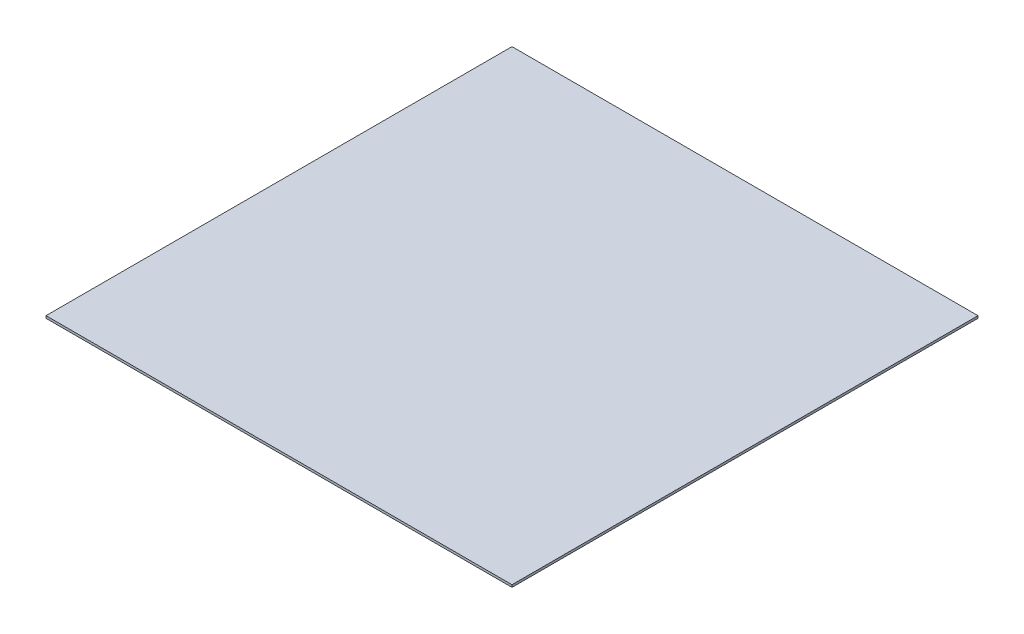
ISO-10303-21;
HEADER;
FILE_DESCRIPTION(('STEP AP214'),'2;1');
FILE_NAME('part.step','',(''),(''),'','','');
FILE_SCHEMA(('AUTOMOTIVE_DESIGN { 1 0 10303 214 1 1 1 1 }'));
ENDSEC;
DATA;
#1=APPLICATION_CONTEXT('core data for automotive mechanical design processes');
#2=APPLICATION_PROTOCOL_DEFINITION('international standard','automotive_design',2000,#1);
#3=PRODUCT_CONTEXT('',#1,'mechanical');
#4=PRODUCT('Part','Part','',(#3));
#5=PRODUCT_RELATED_PRODUCT_CATEGORY('part','',(#4));
#6=PRODUCT_DEFINITION_FORMATION('','',#4);
#7=PRODUCT_DEFINITION_CONTEXT('part definition',#1,'design');
#8=PRODUCT_DEFINITION('design','',#6,#7);
#9=PRODUCT_DEFINITION_SHAPE('','',#8);
#10=(LENGTH_UNIT() NAMED_UNIT(*) SI_UNIT(.MILLI.,.METRE.));
#11=(NAMED_UNIT(*) PLANE_ANGLE_UNIT() SI_UNIT($,.RADIAN.));
#12=(NAMED_UNIT(*) SI_UNIT($,.STERADIAN.) SOLID_ANGLE_UNIT());
#13=UNCERTAINTY_MEASURE_WITH_UNIT(LENGTH_MEASURE(1.E-05),#10,'distance_accuracy_value','');
#14=(GEOMETRIC_REPRESENTATION_CONTEXT(3) GLOBAL_UNCERTAINTY_ASSIGNED_CONTEXT((#13)) GLOBAL_UNIT_ASSIGNED_CONTEXT((#10,
#11,#12)) REPRESENTATION_CONTEXT('',''));
#15=CARTESIAN_POINT('',(0.,0.,0.));
#16=DIRECTION('',(0.,0.,1.));
#17=DIRECTION('',(1.,0.,0.));
#18=AXIS2_PLACEMENT_3D('',#15,#16,#17);
#19=CARTESIAN_POINT('',(-300.,1.5,300.));
#20=DIRECTION('',(1.,0.,0.));
#21=DIRECTION('',(0.,0.,-1.));
#22=AXIS2_PLACEMENT_3D('',#19,#20,#21);
#23=PLANE('',#22);
#24=DIRECTION('',(0.,0.,1.));
#25=VECTOR('',#24,1.);
#26=CARTESIAN_POINT('',(-300.,-1.5,300.));
#27=LINE('',#26,#25);
#28=CARTESIAN_POINT('',(-300.,-1.5,-300.));
#29=VERTEX_POINT('',#28);
#30=CARTESIAN_POINT('',(-300.,-1.5,300.));
#31=VERTEX_POINT('',#30);
#32=EDGE_CURVE('E96',#29,#31,#27,.T.);
#33=ORIENTED_EDGE('',*,*,#32,.T.);
#34=DIRECTION('',(0.,-1.,0.));
#35=VECTOR('',#34,1.);
#36=CARTESIAN_POINT('',(-300.,1.5,300.));
#37=LINE('',#36,#35);
#38=CARTESIAN_POINT('',(-300.,1.5,300.));
#39=VERTEX_POINT('',#38);
#40=EDGE_CURVE('E11',#39,#31,#37,.T.);
#41=ORIENTED_EDGE('',*,*,#40,.F.);
#42=DIRECTION('',(0.,0.,1.));
#43=VECTOR('',#42,1.);
#44=CARTESIAN_POINT('',(-300.,1.5,300.));
#45=LINE('',#44,#43);
#46=CARTESIAN_POINT('',(-300.,1.5,-300.));
#47=VERTEX_POINT('',#46);
#48=EDGE_CURVE('E84',#47,#39,#45,.T.);
#49=ORIENTED_EDGE('',*,*,#48,.F.);
#50=DIRECTION('',(0.,-1.,0.));
#51=VECTOR('',#50,1.);
#52=CARTESIAN_POINT('',(-300.,1.5,-300.));
#53=LINE('',#52,#51);
#54=EDGE_CURVE('E92',#47,#29,#53,.T.);
#55=ORIENTED_EDGE('',*,*,#54,.T.);
#56=EDGE_LOOP('',(#33,#41,#49,#55));
#57=FACE_BOUND('',#56,.T.);
#58=ADVANCED_FACE('F33',(#57),#23,.F.);
#59=CARTESIAN_POINT('',(300.,1.5,300.));
#60=DIRECTION('',(0.,0.,-1.));
#61=DIRECTION('',(-1.,0.,0.));
#62=AXIS2_PLACEMENT_3D('',#59,#60,#61);
#63=PLANE('',#62);
#64=DIRECTION('',(1.,0.,0.));
#65=VECTOR('',#64,1.);
#66=CARTESIAN_POINT('',(300.,-1.5,300.));
#67=LINE('',#66,#65);
#68=CARTESIAN_POINT('',(300.,-1.5,300.));
#69=VERTEX_POINT('',#68);
#70=EDGE_CURVE('E88',#31,#69,#67,.T.);
#71=ORIENTED_EDGE('',*,*,#70,.T.);
#72=DIRECTION('',(0.,-1.,0.));
#73=VECTOR('',#72,1.);
#74=CARTESIAN_POINT('',(300.,1.5,300.));
#75=LINE('',#74,#73);
#76=CARTESIAN_POINT('',(300.,1.5,300.));
#77=VERTEX_POINT('',#76);
#78=EDGE_CURVE('E41',#77,#69,#75,.T.);
#79=ORIENTED_EDGE('',*,*,#78,.F.);
#80=DIRECTION('',(1.,0.,0.));
#81=VECTOR('',#80,1.);
#82=CARTESIAN_POINT('',(300.,1.5,300.));
#83=LINE('',#82,#81);
#84=EDGE_CURVE('E79',#39,#77,#83,.T.);
#85=ORIENTED_EDGE('',*,*,#84,.F.);
#86=ORIENTED_EDGE('',*,*,#40,.T.);
#87=EDGE_LOOP('',(#71,#79,#85,#86));
#88=FACE_BOUND('',#87,.T.);
#89=ADVANCED_FACE('F87',(#88),#63,.F.);
#90=CARTESIAN_POINT('',(300.,1.5,300.));
#91=DIRECTION('',(-1.,0.,0.));
#92=DIRECTION('',(0.,0.,1.));
#93=AXIS2_PLACEMENT_3D('',#90,#91,#92);
#94=PLANE('',#93);
#95=DIRECTION('',(0.,0.,-1.));
#96=VECTOR('',#95,1.);
#97=CARTESIAN_POINT('',(300.,-1.5,300.));
#98=LINE('',#97,#96);
#99=CARTESIAN_POINT('',(300.,-1.5,-300.));
#100=VERTEX_POINT('',#99);
#101=EDGE_CURVE('E66',#69,#100,#98,.T.);
#102=ORIENTED_EDGE('',*,*,#101,.T.);
#103=DIRECTION('',(0.,-1.,0.));
#104=VECTOR('',#103,1.);
#105=CARTESIAN_POINT('',(300.,1.5,-300.));
#106=LINE('',#105,#104);
#107=CARTESIAN_POINT('',(300.,1.5,-300.));
#108=VERTEX_POINT('',#107);
#109=EDGE_CURVE('E89',#108,#100,#106,.T.);
#110=ORIENTED_EDGE('',*,*,#109,.F.);
#111=DIRECTION('',(0.,0.,-1.));
#112=VECTOR('',#111,1.);
#113=CARTESIAN_POINT('',(300.,1.5,300.));
#114=LINE('',#113,#112);
#115=EDGE_CURVE('E82',#77,#108,#114,.T.);
#116=ORIENTED_EDGE('',*,*,#115,.F.);
#117=ORIENTED_EDGE('',*,*,#78,.T.);
#118=EDGE_LOOP('',(#102,#110,#116,#117));
#119=FACE_BOUND('',#118,.T.);
#120=ADVANCED_FACE('F90',(#119),#94,.F.);
#121=CARTESIAN_POINT('',(300.,1.5,-300.));
#122=DIRECTION('',(0.,0.,1.));
#123=DIRECTION('',(1.,0.,0.));
#124=AXIS2_PLACEMENT_3D('',#121,#122,#123);
#125=PLANE('',#124);
#126=DIRECTION('',(-1.,0.,0.));
#127=VECTOR('',#126,1.);
#128=CARTESIAN_POINT('',(300.,-1.5,-300.));
#129=LINE('',#128,#127);
#130=EDGE_CURVE('E72',#100,#29,#129,.T.);
#131=ORIENTED_EDGE('',*,*,#130,.T.);
#132=ORIENTED_EDGE('',*,*,#54,.F.);
#133=DIRECTION('',(-1.,0.,0.));
#134=VECTOR('',#133,1.);
#135=CARTESIAN_POINT('',(300.,1.5,-300.));
#136=LINE('',#135,#134);
#137=EDGE_CURVE('E49',#108,#47,#136,.T.);
#138=ORIENTED_EDGE('',*,*,#137,.F.);
#139=ORIENTED_EDGE('',*,*,#109,.T.);
#140=EDGE_LOOP('',(#131,#132,#138,#139));
#141=FACE_BOUND('',#140,.T.);
#142=ADVANCED_FACE('F103',(#141),#125,.F.);
#143=CARTESIAN_POINT('',(0.,1.5,0.));
#144=DIRECTION('',(0.,1.,0.));
#145=DIRECTION('',(0.,0.,1.));
#146=AXIS2_PLACEMENT_3D('',#143,#144,#145);
#147=PLANE('',#146);
#148=ORIENTED_EDGE('',*,*,#48,.T.);
#149=ORIENTED_EDGE('',*,*,#84,.T.);
#150=ORIENTED_EDGE('',*,*,#115,.T.);
#151=ORIENTED_EDGE('',*,*,#137,.T.);
#152=EDGE_LOOP('',(#148,#149,#150,#151));
#153=FACE_BOUND('',#152,.T.);
#154=ADVANCED_FACE('F80',(#153),#147,.T.);
#155=CARTESIAN_POINT('',(0.,-1.5,0.));
#156=DIRECTION('',(0.,1.,0.));
#157=DIRECTION('',(0.,0.,1.));
#158=AXIS2_PLACEMENT_3D('',#155,#156,#157);
#159=PLANE('',#158);
#160=ORIENTED_EDGE('',*,*,#32,.F.);
#161=ORIENTED_EDGE('',*,*,#130,.F.);
#162=ORIENTED_EDGE('',*,*,#101,.F.);
#163=ORIENTED_EDGE('',*,*,#70,.F.);
#164=EDGE_LOOP('',(#160,#161,#162,#163));
#165=FACE_BOUND('',#164,.T.);
#166=ADVANCED_FACE('F106',(#165),#159,.F.);
#167=CLOSED_SHELL('',(#58,#89,#120,#142,#154,#166));
#168=MANIFOLD_SOLID_BREP('B2',#167);
#169=ADVANCED_BREP_SHAPE_REPRESENTATION('',(#18,#168),#14);
#170=SHAPE_DEFINITION_REPRESENTATION(#9,#169);
ENDSEC;
END-ISO-10303-21;
